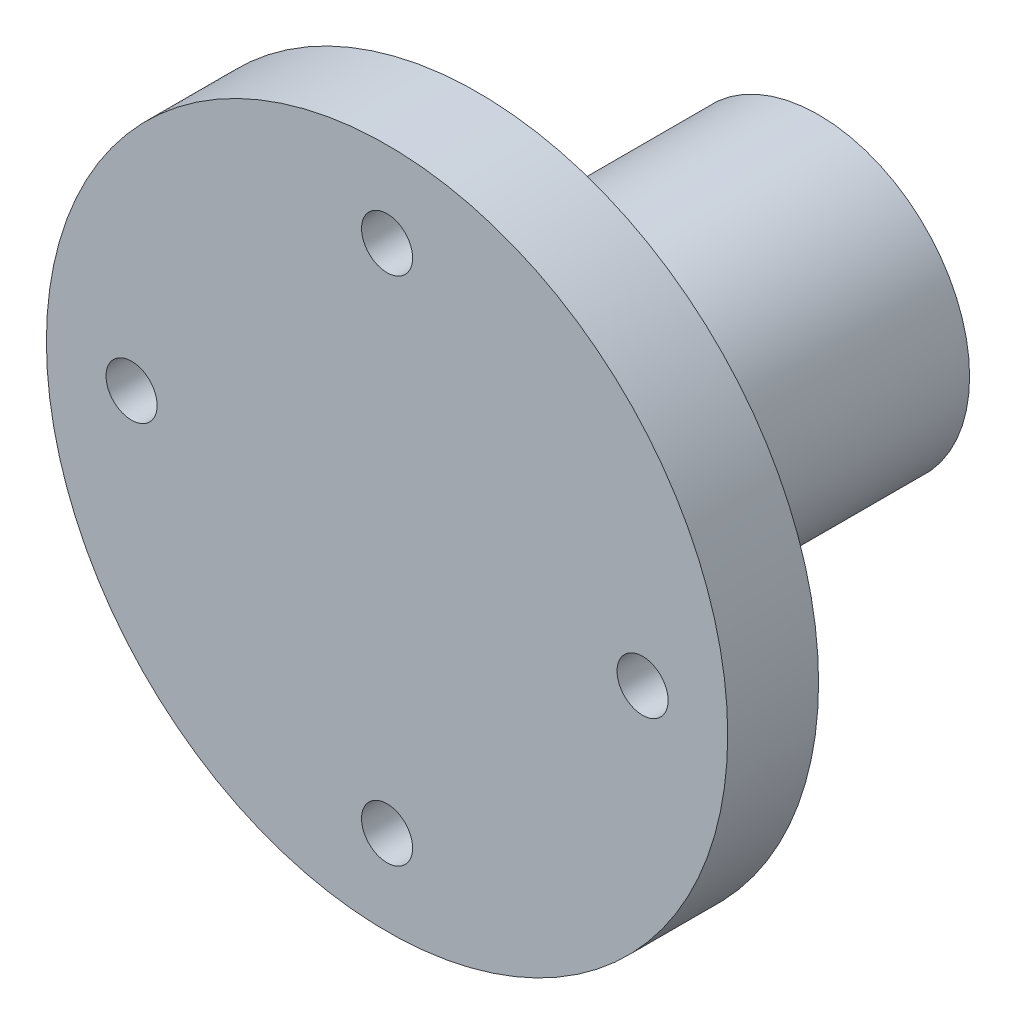
ISO-10303-21;
HEADER;
FILE_DESCRIPTION(('STEP AP214'),'2;1');
FILE_NAME('part.step','',(''),(''),'','','');
FILE_SCHEMA(('AUTOMOTIVE_DESIGN { 1 0 10303 214 1 1 1 1 }'));
ENDSEC;
DATA;
#1=APPLICATION_CONTEXT('core data for automotive mechanical design processes');
#2=APPLICATION_PROTOCOL_DEFINITION('international standard','automotive_design',2000,#1);
#3=PRODUCT_CONTEXT('',#1,'mechanical');
#4=PRODUCT('Part','Part','',(#3));
#5=PRODUCT_RELATED_PRODUCT_CATEGORY('part','',(#4));
#6=PRODUCT_DEFINITION_FORMATION('','',#4);
#7=PRODUCT_DEFINITION_CONTEXT('part definition',#1,'design');
#8=PRODUCT_DEFINITION('design','',#6,#7);
#9=PRODUCT_DEFINITION_SHAPE('','',#8);
#10=(LENGTH_UNIT() NAMED_UNIT(*) SI_UNIT(.MILLI.,.METRE.));
#11=(NAMED_UNIT(*) PLANE_ANGLE_UNIT() SI_UNIT($,.RADIAN.));
#12=(NAMED_UNIT(*) SI_UNIT($,.STERADIAN.) SOLID_ANGLE_UNIT());
#13=UNCERTAINTY_MEASURE_WITH_UNIT(LENGTH_MEASURE(1.E-05),#10,'distance_accuracy_value','');
#14=(GEOMETRIC_REPRESENTATION_CONTEXT(3) GLOBAL_UNCERTAINTY_ASSIGNED_CONTEXT((#13)) GLOBAL_UNIT_ASSIGNED_CONTEXT((#10,
#11,#12)) REPRESENTATION_CONTEXT('',''));
#15=CARTESIAN_POINT('',(0.,0.,0.));
#16=DIRECTION('',(0.,0.,1.));
#17=DIRECTION('',(1.,0.,0.));
#18=AXIS2_PLACEMENT_3D('',#15,#16,#17);
#19=CARTESIAN_POINT('',(0.,0.,-30.));
#20=DIRECTION('',(0.,0.,1.));
#21=DIRECTION('',(1.,0.,0.));
#22=AXIS2_PLACEMENT_3D('',#19,#20,#21);
#23=CYLINDRICAL_SURFACE('',#22,13.3);
#24=CARTESIAN_POINT('',(0.,0.,-30.));
#25=DIRECTION('',(0.,0.,1.));
#26=DIRECTION('',(1.,0.,0.));
#27=AXIS2_PLACEMENT_3D('',#24,#25,#26);
#28=CIRCLE('',#27,13.3);
#29=CARTESIAN_POINT('',(13.3,0.,-30.));
#30=VERTEX_POINT('',#29);
#31=EDGE_CURVE('E10',#30,#30,#28,.T.);
#32=ORIENTED_EDGE('',*,*,#31,.T.);
#33=EDGE_LOOP('',(#32));
#34=FACE_BOUND('',#33,.T.);
#35=CARTESIAN_POINT('',(0.,0.,0.));
#36=DIRECTION('',(0.,0.,1.));
#37=DIRECTION('',(1.,0.,0.));
#38=AXIS2_PLACEMENT_3D('',#35,#36,#37);
#39=CIRCLE('',#38,13.3);
#40=CARTESIAN_POINT('',(13.3,0.,0.));
#41=VERTEX_POINT('',#40);
#42=EDGE_CURVE('E40',#41,#41,#39,.T.);
#43=ORIENTED_EDGE('',*,*,#42,.F.);
#44=EDGE_LOOP('',(#43));
#45=FACE_BOUND('',#44,.T.);
#46=ADVANCED_FACE('F37',(#34,#45),#23,.T.);
#47=CARTESIAN_POINT('',(0.,0.,-30.));
#48=DIRECTION('',(0.,0.,1.));
#49=DIRECTION('',(1.,0.,0.));
#50=AXIS2_PLACEMENT_3D('',#47,#48,#49);
#51=PLANE('',#50);
#52=ORIENTED_EDGE('',*,*,#31,.F.);
#53=EDGE_LOOP('',(#52));
#54=FACE_BOUND('',#53,.T.);
#55=ADVANCED_FACE('F85',(#54),#51,.F.);
#56=CARTESIAN_POINT('',(0.,0.,8.));
#57=DIRECTION('',(0.,0.,1.));
#58=DIRECTION('',(1.,0.,0.));
#59=AXIS2_PLACEMENT_3D('',#56,#57,#58);
#60=PLANE('',#59);
#61=CARTESIAN_POINT('',(-1.57116660247941E-13,-22.5,8.));
#62=DIRECTION('',(0.,0.,1.));
#63=DIRECTION('',(1.,0.,0.));
#64=AXIS2_PLACEMENT_3D('',#61,#62,#63);
#65=CIRCLE('',#64,2.25);
#66=CARTESIAN_POINT('',(2.24999999999984,-22.5,8.));
#67=VERTEX_POINT('',#66);
#68=EDGE_CURVE('E64',#67,#67,#65,.T.);
#69=ORIENTED_EDGE('',*,*,#68,.F.);
#70=EDGE_LOOP('',(#69));
#71=FACE_BOUND('',#70,.T.);
#72=CARTESIAN_POINT('',(0.,22.5,8.));
#73=DIRECTION('',(0.,0.,1.));
#74=DIRECTION('',(1.,0.,0.));
#75=AXIS2_PLACEMENT_3D('',#72,#73,#74);
#76=CIRCLE('',#75,2.25);
#77=CARTESIAN_POINT('',(2.25,22.5,8.));
#78=VERTEX_POINT('',#77);
#79=EDGE_CURVE('E52',#78,#78,#76,.T.);
#80=ORIENTED_EDGE('',*,*,#79,.F.);
#81=EDGE_LOOP('',(#80));
#82=FACE_BOUND('',#81,.T.);
#83=CARTESIAN_POINT('',(0.,0.,8.));
#84=DIRECTION('',(0.,0.,1.));
#85=DIRECTION('',(1.,0.,0.));
#86=AXIS2_PLACEMENT_3D('',#83,#84,#85);
#87=CIRCLE('',#86,30.);
#88=CARTESIAN_POINT('',(30.,0.,8.));
#89=VERTEX_POINT('',#88);
#90=EDGE_CURVE('E47',#89,#89,#87,.T.);
#91=ORIENTED_EDGE('',*,*,#90,.T.);
#92=EDGE_LOOP('',(#91));
#93=FACE_BOUND('',#92,.T.);
#94=CARTESIAN_POINT('',(22.5,0.,8.));
#95=DIRECTION('',(0.,0.,1.));
#96=DIRECTION('',(1.,0.,0.));
#97=AXIS2_PLACEMENT_3D('',#94,#95,#96);
#98=CIRCLE('',#97,2.25);
#99=CARTESIAN_POINT('',(24.75,0.,8.));
#100=VERTEX_POINT('',#99);
#101=EDGE_CURVE('E58',#100,#100,#98,.T.);
#102=ORIENTED_EDGE('',*,*,#101,.F.);
#103=EDGE_LOOP('',(#102));
#104=FACE_BOUND('',#103,.T.);
#105=CARTESIAN_POINT('',(-22.5,2.35674990371912E-13,8.));
#106=DIRECTION('',(0.,0.,1.));
#107=DIRECTION('',(1.,0.,0.));
#108=AXIS2_PLACEMENT_3D('',#105,#106,#107);
#109=CIRCLE('',#108,2.25);
#110=CARTESIAN_POINT('',(-20.25,2.35674990371912E-13,8.));
#111=VERTEX_POINT('',#110);
#112=EDGE_CURVE('E70',#111,#111,#109,.T.);
#113=ORIENTED_EDGE('',*,*,#112,.F.);
#114=EDGE_LOOP('',(#113));
#115=FACE_BOUND('',#114,.T.);
#116=ADVANCED_FACE('F82',(#71,#82,#93,#104,#115),#60,.T.);
#117=CARTESIAN_POINT('',(0.,0.,0.));
#118=DIRECTION('',(0.,0.,1.));
#119=DIRECTION('',(1.,0.,0.));
#120=AXIS2_PLACEMENT_3D('',#117,#118,#119);
#121=PLANE('',#120);
#122=ORIENTED_EDGE('',*,*,#42,.T.);
#123=EDGE_LOOP('',(#122));
#124=FACE_BOUND('',#123,.T.);
#125=CARTESIAN_POINT('',(0.,0.,0.));
#126=DIRECTION('',(0.,0.,1.));
#127=DIRECTION('',(1.,0.,0.));
#128=AXIS2_PLACEMENT_3D('',#125,#126,#127);
#129=CIRCLE('',#128,30.);
#130=CARTESIAN_POINT('',(30.,0.,0.));
#131=VERTEX_POINT('',#130);
#132=EDGE_CURVE('E49',#131,#131,#129,.T.);
#133=ORIENTED_EDGE('',*,*,#132,.F.);
#134=EDGE_LOOP('',(#133));
#135=FACE_BOUND('',#134,.T.);
#136=CARTESIAN_POINT('',(0.,22.5,0.));
#137=DIRECTION('',(0.,0.,1.));
#138=DIRECTION('',(1.,0.,0.));
#139=AXIS2_PLACEMENT_3D('',#136,#137,#138);
#140=CIRCLE('',#139,2.25);
#141=CARTESIAN_POINT('',(2.25,22.5,0.));
#142=VERTEX_POINT('',#141);
#143=EDGE_CURVE('E55',#142,#142,#140,.T.);
#144=ORIENTED_EDGE('',*,*,#143,.T.);
#145=EDGE_LOOP('',(#144));
#146=FACE_BOUND('',#145,.T.);
#147=CARTESIAN_POINT('',(22.5,0.,0.));
#148=DIRECTION('',(0.,0.,1.));
#149=DIRECTION('',(1.,0.,0.));
#150=AXIS2_PLACEMENT_3D('',#147,#148,#149);
#151=CIRCLE('',#150,2.25);
#152=CARTESIAN_POINT('',(24.75,0.,0.));
#153=VERTEX_POINT('',#152);
#154=EDGE_CURVE('E61',#153,#153,#151,.T.);
#155=ORIENTED_EDGE('',*,*,#154,.T.);
#156=EDGE_LOOP('',(#155));
#157=FACE_BOUND('',#156,.T.);
#158=CARTESIAN_POINT('',(-1.57116660247941E-13,-22.5,0.));
#159=DIRECTION('',(0.,0.,1.));
#160=DIRECTION('',(1.,0.,0.));
#161=AXIS2_PLACEMENT_3D('',#158,#159,#160);
#162=CIRCLE('',#161,2.25);
#163=CARTESIAN_POINT('',(2.24999999999984,-22.5,0.));
#164=VERTEX_POINT('',#163);
#165=EDGE_CURVE('E67',#164,#164,#162,.T.);
#166=ORIENTED_EDGE('',*,*,#165,.T.);
#167=EDGE_LOOP('',(#166));
#168=FACE_BOUND('',#167,.T.);
#169=CARTESIAN_POINT('',(-22.5,2.35674990371912E-13,0.));
#170=DIRECTION('',(0.,0.,1.));
#171=DIRECTION('',(1.,0.,0.));
#172=AXIS2_PLACEMENT_3D('',#169,#170,#171);
#173=CIRCLE('',#172,2.25);
#174=CARTESIAN_POINT('',(-20.25,2.35674990371912E-13,0.));
#175=VERTEX_POINT('',#174);
#176=EDGE_CURVE('E73',#175,#175,#173,.T.);
#177=ORIENTED_EDGE('',*,*,#176,.T.);
#178=EDGE_LOOP('',(#177));
#179=FACE_BOUND('',#178,.T.);
#180=ADVANCED_FACE('F84',(#124,#135,#146,#157,#168,#179),#121,.F.);
#181=CARTESIAN_POINT('',(0.,0.,8.));
#182=DIRECTION('',(0.,0.,-1.));
#183=DIRECTION('',(-1.,0.,0.));
#184=AXIS2_PLACEMENT_3D('',#181,#182,#183);
#185=CYLINDRICAL_SURFACE('',#184,30.);
#186=ORIENTED_EDGE('',*,*,#90,.F.);
#187=EDGE_LOOP('',(#186));
#188=FACE_BOUND('',#187,.T.);
#189=ORIENTED_EDGE('',*,*,#132,.T.);
#190=EDGE_LOOP('',(#189));
#191=FACE_BOUND('',#190,.T.);
#192=ADVANCED_FACE('F92',(#188,#191),#185,.T.);
#193=CARTESIAN_POINT('',(0.,22.5,8.));
#194=DIRECTION('',(0.,0.,-1.));
#195=DIRECTION('',(-1.,0.,0.));
#196=AXIS2_PLACEMENT_3D('',#193,#194,#195);
#197=CYLINDRICAL_SURFACE('',#196,2.25);
#198=ORIENTED_EDGE('',*,*,#79,.T.);
#199=EDGE_LOOP('',(#198));
#200=FACE_BOUND('',#199,.T.);
#201=ORIENTED_EDGE('',*,*,#143,.F.);
#202=EDGE_LOOP('',(#201));
#203=FACE_BOUND('',#202,.T.);
#204=ADVANCED_FACE('F125',(#200,#203),#197,.F.);
#205=CARTESIAN_POINT('',(22.5,0.,8.));
#206=DIRECTION('',(0.,0.,-1.));
#207=DIRECTION('',(-1.,0.,0.));
#208=AXIS2_PLACEMENT_3D('',#205,#206,#207);
#209=CYLINDRICAL_SURFACE('',#208,2.25);
#210=ORIENTED_EDGE('',*,*,#101,.T.);
#211=EDGE_LOOP('',(#210));
#212=FACE_BOUND('',#211,.T.);
#213=ORIENTED_EDGE('',*,*,#154,.F.);
#214=EDGE_LOOP('',(#213));
#215=FACE_BOUND('',#214,.T.);
#216=ADVANCED_FACE('F120',(#212,#215),#209,.F.);
#217=CARTESIAN_POINT('',(-1.57116660247941E-13,-22.5,8.));
#218=DIRECTION('',(0.,0.,-1.));
#219=DIRECTION('',(-1.,0.,0.));
#220=AXIS2_PLACEMENT_3D('',#217,#218,#219);
#221=CYLINDRICAL_SURFACE('',#220,2.25);
#222=ORIENTED_EDGE('',*,*,#68,.T.);
#223=EDGE_LOOP('',(#222));
#224=FACE_BOUND('',#223,.T.);
#225=ORIENTED_EDGE('',*,*,#165,.F.);
#226=EDGE_LOOP('',(#225));
#227=FACE_BOUND('',#226,.T.);
#228=ADVANCED_FACE('F115',(#224,#227),#221,.F.);
#229=CARTESIAN_POINT('',(-22.5,2.35674990371912E-13,8.));
#230=DIRECTION('',(0.,0.,-1.));
#231=DIRECTION('',(-1.,0.,0.));
#232=AXIS2_PLACEMENT_3D('',#229,#230,#231);
#233=CYLINDRICAL_SURFACE('',#232,2.25);
#234=ORIENTED_EDGE('',*,*,#112,.T.);
#235=EDGE_LOOP('',(#234));
#236=FACE_BOUND('',#235,.T.);
#237=ORIENTED_EDGE('',*,*,#176,.F.);
#238=EDGE_LOOP('',(#237));
#239=FACE_BOUND('',#238,.T.);
#240=ADVANCED_FACE('F79',(#236,#239),#233,.F.);
#241=CLOSED_SHELL('',(#46,#55,#116,#180,#192,#204,#216,#228,#240));
#242=MANIFOLD_SOLID_BREP('B2',#241);
#243=ADVANCED_BREP_SHAPE_REPRESENTATION('',(#18,#242),#14);
#244=SHAPE_DEFINITION_REPRESENTATION(#9,#243);
ENDSEC;
END-ISO-10303-21;
